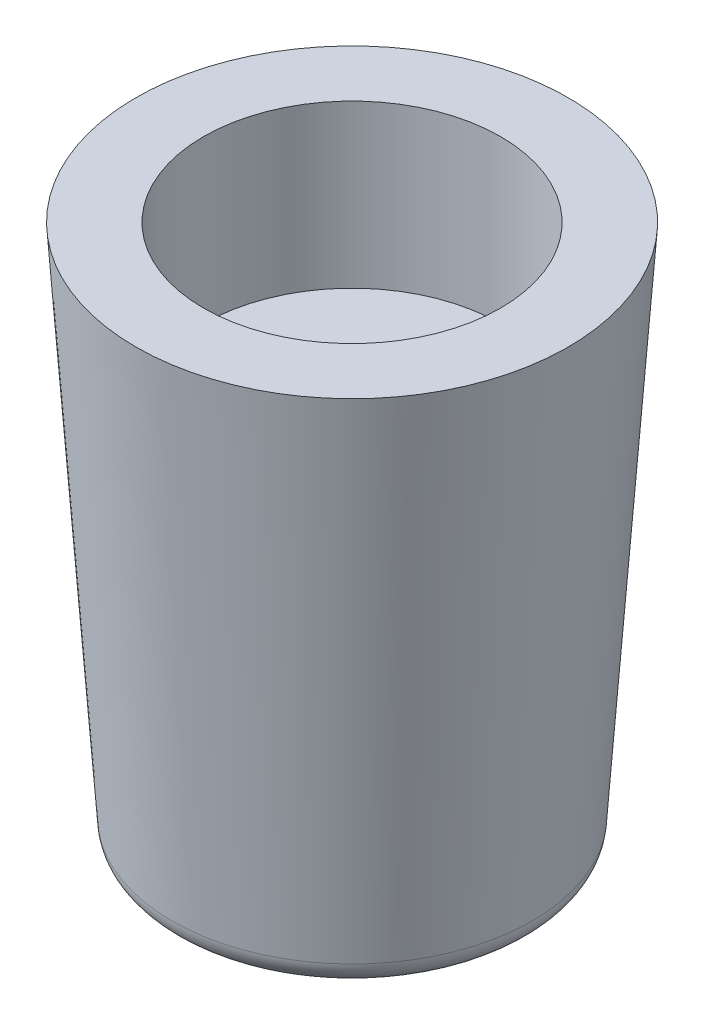
ISO-10303-21;
HEADER;
FILE_DESCRIPTION(('STEP AP214'),'2;1');
FILE_NAME('part.step','',(''),(''),'','','');
FILE_SCHEMA(('AUTOMOTIVE_DESIGN { 1 0 10303 214 1 1 1 1 }'));
ENDSEC;
DATA;
#1=APPLICATION_CONTEXT('core data for automotive mechanical design processes');
#2=APPLICATION_PROTOCOL_DEFINITION('international standard','automotive_design',2000,#1);
#3=PRODUCT_CONTEXT('',#1,'mechanical');
#4=PRODUCT('Part','Part','',(#3));
#5=PRODUCT_RELATED_PRODUCT_CATEGORY('part','',(#4));
#6=PRODUCT_DEFINITION_FORMATION('','',#4);
#7=PRODUCT_DEFINITION_CONTEXT('part definition',#1,'design');
#8=PRODUCT_DEFINITION('design','',#6,#7);
#9=PRODUCT_DEFINITION_SHAPE('','',#8);
#10=(LENGTH_UNIT() NAMED_UNIT(*) SI_UNIT(.MILLI.,.METRE.));
#11=(NAMED_UNIT(*) PLANE_ANGLE_UNIT() SI_UNIT($,.RADIAN.));
#12=(NAMED_UNIT(*) SI_UNIT($,.STERADIAN.) SOLID_ANGLE_UNIT());
#13=UNCERTAINTY_MEASURE_WITH_UNIT(LENGTH_MEASURE(1.E-05),#10,'distance_accuracy_value','');
#14=(GEOMETRIC_REPRESENTATION_CONTEXT(3) GLOBAL_UNCERTAINTY_ASSIGNED_CONTEXT((#13)) GLOBAL_UNIT_ASSIGNED_CONTEXT((#10,
#11,#12)) REPRESENTATION_CONTEXT('',''));
#15=CARTESIAN_POINT('',(0.,0.,0.));
#16=DIRECTION('',(0.,0.,1.));
#17=DIRECTION('',(1.,0.,0.));
#18=AXIS2_PLACEMENT_3D('',#15,#16,#17);
#19=CARTESIAN_POINT('',(0.,0.,0.));
#20=DIRECTION('',(0.,1.,0.));
#21=DIRECTION('',(0.,0.,1.));
#22=AXIS2_PLACEMENT_3D('',#19,#20,#21);
#23=CONICAL_SURFACE('',#22,4.,0.0698131700797733);
#24=CARTESIAN_POINT('',(0.,-9.53487823687206,0.));
#25=DIRECTION('',(0.,1.,0.));
#26=DIRECTION('',(0.,0.,1.));
#27=AXIS2_PLACEMENT_3D('',#24,#25,#26);
#28=CIRCLE('',#27,3.33325636262598);
#29=CARTESIAN_POINT('',(0.,-9.53487823687206,3.33325636262598));
#30=VERTEX_POINT('',#29);
#31=EDGE_CURVE('E38',#30,#30,#28,.T.);
#32=ORIENTED_EDGE('',*,*,#31,.T.);
#33=EDGE_LOOP('',(#32));
#34=FACE_BOUND('',#33,.T.);
#35=CARTESIAN_POINT('',(0.,0.,0.));
#36=DIRECTION('',(0.,1.,0.));
#37=DIRECTION('',(0.,0.,1.));
#38=AXIS2_PLACEMENT_3D('',#35,#36,#37);
#39=CIRCLE('',#38,4.);
#40=CARTESIAN_POINT('',(0.,0.,4.));
#41=VERTEX_POINT('',#40);
#42=EDGE_CURVE('E42',#41,#41,#39,.T.);
#43=ORIENTED_EDGE('',*,*,#42,.F.);
#44=EDGE_LOOP('',(#43));
#45=FACE_BOUND('',#44,.T.);
#46=ADVANCED_FACE('F31',(#34,#45),#23,.T.);
#47=CARTESIAN_POINT('',(0.,-10.,0.));
#48=DIRECTION('',(0.,1.,0.));
#49=DIRECTION('',(0.,0.,1.));
#50=AXIS2_PLACEMENT_3D('',#47,#48,#49);
#51=PLANE('',#50);
#52=CARTESIAN_POINT('',(0.,-10.,0.));
#53=DIRECTION('',(0.,1.,0.));
#54=DIRECTION('',(0.,0.,1.));
#55=AXIS2_PLACEMENT_3D('',#52,#53,#54);
#56=CIRCLE('',#55,2.83447433749606);
#57=CARTESIAN_POINT('',(0.,-10.,2.83447433749606));
#58=VERTEX_POINT('',#57);
#59=EDGE_CURVE('E10',#58,#58,#56,.F.);
#60=ORIENTED_EDGE('',*,*,#59,.T.);
#61=EDGE_LOOP('',(#60));
#62=FACE_BOUND('',#61,.T.);
#63=ADVANCED_FACE('F66',(#62),#51,.F.);
#64=CARTESIAN_POINT('',(0.,0.,0.));
#65=DIRECTION('',(0.,1.,0.));
#66=DIRECTION('',(0.,0.,1.));
#67=AXIS2_PLACEMENT_3D('',#64,#65,#66);
#68=PLANE('',#67);
#69=CARTESIAN_POINT('',(0.,0.,0.));
#70=DIRECTION('',(0.,1.,0.));
#71=DIRECTION('',(0.,0.,1.));
#72=AXIS2_PLACEMENT_3D('',#69,#70,#71);
#73=CIRCLE('',#72,2.75);
#74=CARTESIAN_POINT('',(0.,0.,2.75));
#75=VERTEX_POINT('',#74);
#76=EDGE_CURVE('E49',#75,#75,#73,.T.);
#77=ORIENTED_EDGE('',*,*,#76,.F.);
#78=EDGE_LOOP('',(#77));
#79=FACE_BOUND('',#78,.T.);
#80=ORIENTED_EDGE('',*,*,#42,.T.);
#81=EDGE_LOOP('',(#80));
#82=FACE_BOUND('',#81,.T.);
#83=ADVANCED_FACE('F60',(#79,#82),#68,.T.);
#84=CARTESIAN_POINT('',(0.,-3.,0.));
#85=DIRECTION('',(0.,1.,0.));
#86=DIRECTION('',(0.,0.,1.));
#87=AXIS2_PLACEMENT_3D('',#84,#85,#86);
#88=CYLINDRICAL_SURFACE('',#87,2.75);
#89=CARTESIAN_POINT('',(0.,-3.,0.));
#90=DIRECTION('',(0.,1.,0.));
#91=DIRECTION('',(0.,0.,1.));
#92=AXIS2_PLACEMENT_3D('',#89,#90,#91);
#93=CIRCLE('',#92,2.75);
#94=CARTESIAN_POINT('',(0.,-3.,2.75));
#95=VERTEX_POINT('',#94);
#96=EDGE_CURVE('E46',#95,#95,#93,.T.);
#97=ORIENTED_EDGE('',*,*,#96,.F.);
#98=EDGE_LOOP('',(#97));
#99=FACE_BOUND('',#98,.T.);
#100=ORIENTED_EDGE('',*,*,#76,.T.);
#101=EDGE_LOOP('',(#100));
#102=FACE_BOUND('',#101,.T.);
#103=ADVANCED_FACE('F57',(#99,#102),#88,.F.);
#104=CARTESIAN_POINT('',(0.,-3.,0.));
#105=DIRECTION('',(0.,1.,0.));
#106=DIRECTION('',(0.,0.,1.));
#107=AXIS2_PLACEMENT_3D('',#104,#105,#106);
#108=PLANE('',#107);
#109=ORIENTED_EDGE('',*,*,#96,.T.);
#110=EDGE_LOOP('',(#109));
#111=FACE_BOUND('',#110,.T.);
#112=ADVANCED_FACE('F55',(#111),#108,.T.);
#113=CARTESIAN_POINT('',(0.,-9.5,0.));
#114=DIRECTION('',(0.,1.,0.));
#115=DIRECTION('',(0.,0.,1.));
#116=AXIS2_PLACEMENT_3D('',#113,#114,#115);
#117=TOROIDAL_SURFACE('',#116,2.83447433749606,0.5);
#118=ORIENTED_EDGE('',*,*,#59,.F.);
#119=EDGE_LOOP('',(#118));
#120=FACE_BOUND('',#119,.T.);
#121=ORIENTED_EDGE('',*,*,#31,.F.);
#122=EDGE_LOOP('',(#121));
#123=FACE_BOUND('',#122,.T.);
#124=ADVANCED_FACE('F33',(#120,#123),#117,.T.);
#125=CLOSED_SHELL('',(#46,#63,#83,#103,#112,#124));
#126=MANIFOLD_SOLID_BREP('B2',#125);
#127=ADVANCED_BREP_SHAPE_REPRESENTATION('',(#18,#126),#14);
#128=SHAPE_DEFINITION_REPRESENTATION(#9,#127);
ENDSEC;
END-ISO-10303-21;
